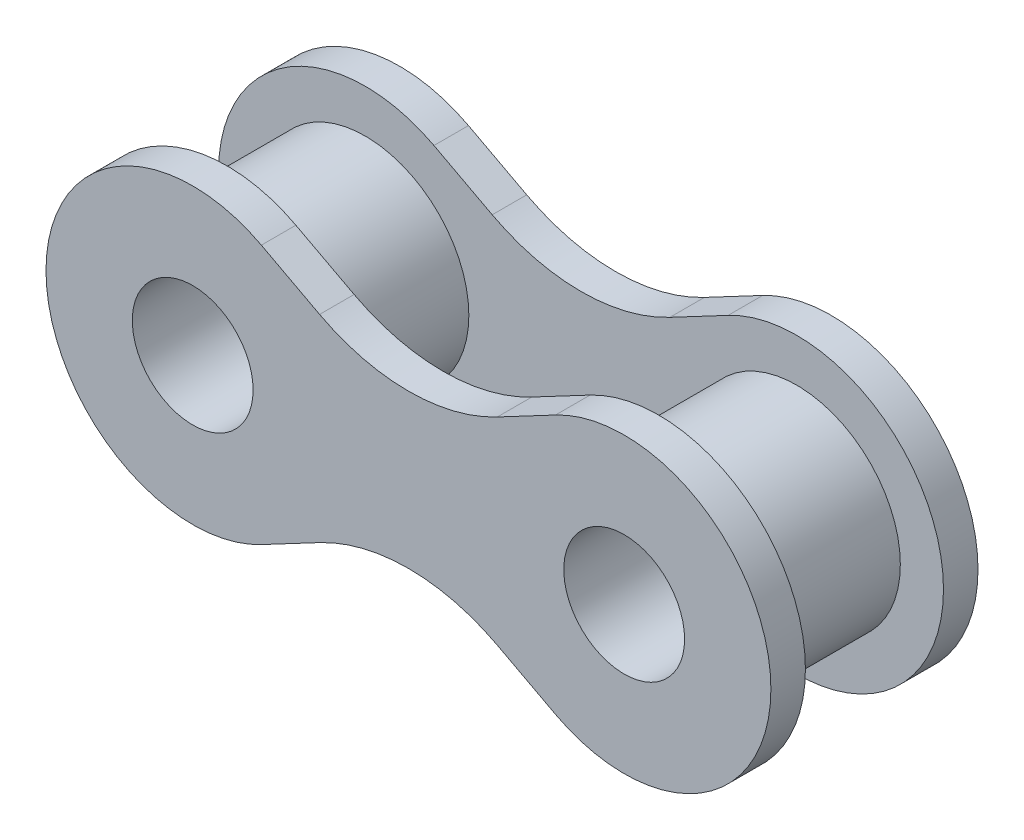
ISO-10303-21;
HEADER;
FILE_DESCRIPTION(('STEP AP214'),'2;1');
FILE_NAME('part.step','',(''),(''),'','','');
FILE_SCHEMA(('AUTOMOTIVE_DESIGN { 1 0 10303 214 1 1 1 1 }'));
ENDSEC;
DATA;
#1=APPLICATION_CONTEXT('core data for automotive mechanical design processes');
#2=APPLICATION_PROTOCOL_DEFINITION('international standard','automotive_design',2000,#1);
#3=PRODUCT_CONTEXT('',#1,'mechanical');
#4=PRODUCT('Part','Part','',(#3));
#5=PRODUCT_RELATED_PRODUCT_CATEGORY('part','',(#4));
#6=PRODUCT_DEFINITION_FORMATION('','',#4);
#7=PRODUCT_DEFINITION_CONTEXT('part definition',#1,'design');
#8=PRODUCT_DEFINITION('design','',#6,#7);
#9=PRODUCT_DEFINITION_SHAPE('','',#8);
#10=(LENGTH_UNIT() NAMED_UNIT(*) SI_UNIT(.MILLI.,.METRE.));
#11=(NAMED_UNIT(*) PLANE_ANGLE_UNIT() SI_UNIT($,.RADIAN.));
#12=(NAMED_UNIT(*) SI_UNIT($,.STERADIAN.) SOLID_ANGLE_UNIT());
#13=UNCERTAINTY_MEASURE_WITH_UNIT(LENGTH_MEASURE(1.E-05),#10,'distance_accuracy_value','');
#14=(GEOMETRIC_REPRESENTATION_CONTEXT(3) GLOBAL_UNCERTAINTY_ASSIGNED_CONTEXT((#13)) GLOBAL_UNIT_ASSIGNED_CONTEXT((#10,
#11,#12)) REPRESENTATION_CONTEXT('',''));
#15=CARTESIAN_POINT('',(0.,0.,0.));
#16=DIRECTION('',(0.,0.,1.));
#17=DIRECTION('',(1.,0.,0.));
#18=AXIS2_PLACEMENT_3D('',#15,#16,#17);
#19=CARTESIAN_POINT('',(-6.25,0.,-8.98528137423857));
#20=DIRECTION('',(0.,0.,1.));
#21=DIRECTION('',(1.,0.,0.));
#22=AXIS2_PLACEMENT_3D('',#19,#20,#21);
#23=CYLINDRICAL_SURFACE('',#22,3.);
#24=CARTESIAN_POINT('',(-6.25,0.,0.5));
#25=DIRECTION('',(0.,0.,1.));
#26=DIRECTION('',(1.,0.,0.));
#27=AXIS2_PLACEMENT_3D('',#24,#25,#26);
#28=CIRCLE('',#27,3.);
#29=CARTESIAN_POINT('',(-3.25,0.,0.5));
#30=VERTEX_POINT('',#29);
#31=EDGE_CURVE('E47',#30,#30,#28,.T.);
#32=ORIENTED_EDGE('',*,*,#31,.T.);
#33=EDGE_LOOP('',(#32));
#34=FACE_BOUND('',#33,.T.);
#35=CARTESIAN_POINT('',(-6.25,0.,4.5));
#36=DIRECTION('',(0.,0.,1.));
#37=DIRECTION('',(1.,0.,0.));
#38=AXIS2_PLACEMENT_3D('',#35,#36,#37);
#39=CIRCLE('',#38,3.);
#40=CARTESIAN_POINT('',(-3.25,0.,4.5));
#41=VERTEX_POINT('',#40);
#42=EDGE_CURVE('E170',#41,#41,#39,.F.);
#43=ORIENTED_EDGE('',*,*,#42,.T.);
#44=EDGE_LOOP('',(#43));
#45=FACE_BOUND('',#44,.T.);
#46=ADVANCED_FACE('F37',(#34,#45),#23,.T.);
#47=CARTESIAN_POINT('',(6.25,0.,0.5));
#48=DIRECTION('',(0.,0.,1.));
#49=DIRECTION('',(1.,0.,0.));
#50=AXIS2_PLACEMENT_3D('',#47,#48,#49);
#51=PLANE('',#50);
#52=CARTESIAN_POINT('',(6.25,0.,0.5));
#53=DIRECTION('',(0.,0.,1.));
#54=DIRECTION('',(1.,0.,0.));
#55=AXIS2_PLACEMENT_3D('',#52,#53,#54);
#56=CIRCLE('',#55,3.);
#57=CARTESIAN_POINT('',(9.25,0.,0.5));
#58=VERTEX_POINT('',#57);
#59=EDGE_CURVE('E11',#58,#58,#56,.T.);
#60=ORIENTED_EDGE('',*,*,#59,.F.);
#61=EDGE_LOOP('',(#60));
#62=FACE_BOUND('',#61,.T.);
#63=ORIENTED_EDGE('',*,*,#31,.F.);
#64=EDGE_LOOP('',(#63));
#65=FACE_BOUND('',#64,.T.);
#66=CARTESIAN_POINT('',(6.25,0.,0.5));
#67=DIRECTION('',(0.,0.,1.));
#68=DIRECTION('',(1.,0.,0.));
#69=AXIS2_PLACEMENT_3D('',#66,#67,#68);
#70=CIRCLE('',#69,4.25);
#71=CARTESIAN_POINT('',(4.26146170773168,-3.756090448882,0.5));
#72=VERTEX_POINT('',#71);
#73=CARTESIAN_POINT('',(4.26146170773168,3.756090448882,0.5));
#74=VERTEX_POINT('',#73);
#75=EDGE_CURVE('E156',#72,#74,#70,.T.);
#76=ORIENTED_EDGE('',*,*,#75,.T.);
#77=DIRECTION('',(-0.883785987972236,-0.467891362886662,0.));
#78=VECTOR('',#77,1.);
#79=CARTESIAN_POINT('',(2.57340249587665,2.86240313541777,0.5));
#80=LINE('',#79,#78);
#81=CARTESIAN_POINT('',(2.57340249587665,2.86240313541777,0.5));
#82=VERTEX_POINT('',#81);
#83=EDGE_CURVE('E101',#74,#82,#80,.T.);
#84=ORIENTED_EDGE('',*,*,#83,.T.);
#85=CARTESIAN_POINT('',(0.,7.72322606926507,0.5));
#86=DIRECTION('',(0.,0.,-1.));
#87=DIRECTION('',(1.,0.,0.));
#88=AXIS2_PLACEMENT_3D('',#85,#86,#87);
#89=CIRCLE('',#88,5.5);
#90=CARTESIAN_POINT('',(-2.57340249587665,2.86240313541777,0.5));
#91=VERTEX_POINT('',#90);
#92=EDGE_CURVE('E220',#82,#91,#89,.T.);
#93=ORIENTED_EDGE('',*,*,#92,.T.);
#94=DIRECTION('',(-0.883785987972236,0.467891362886663,0.));
#95=VECTOR('',#94,1.);
#96=CARTESIAN_POINT('',(-4.26146170773168,3.756090448882,0.5));
#97=LINE('',#96,#95);
#98=CARTESIAN_POINT('',(-4.26146170773168,3.756090448882,0.5));
#99=VERTEX_POINT('',#98);
#100=EDGE_CURVE('E222',#91,#99,#97,.T.);
#101=ORIENTED_EDGE('',*,*,#100,.T.);
#102=CARTESIAN_POINT('',(-6.25,0.,0.5));
#103=DIRECTION('',(0.,0.,1.));
#104=DIRECTION('',(1.,0.,0.));
#105=AXIS2_PLACEMENT_3D('',#102,#103,#104);
#106=CIRCLE('',#105,4.25);
#107=CARTESIAN_POINT('',(-4.26146170773168,-3.756090448882,0.5));
#108=VERTEX_POINT('',#107);
#109=EDGE_CURVE('E123',#99,#108,#106,.T.);
#110=ORIENTED_EDGE('',*,*,#109,.T.);
#111=DIRECTION('',(0.883785987972236,0.467891362886663,0.));
#112=VECTOR('',#111,1.);
#113=CARTESIAN_POINT('',(-4.26146170773168,-3.756090448882,0.5));
#114=LINE('',#113,#112);
#115=CARTESIAN_POINT('',(-2.57340249587665,-2.86240313541777,0.5));
#116=VERTEX_POINT('',#115);
#117=EDGE_CURVE('E117',#108,#116,#114,.T.);
#118=ORIENTED_EDGE('',*,*,#117,.T.);
#119=CARTESIAN_POINT('',(0.,-7.72322606926507,0.5));
#120=DIRECTION('',(0.,0.,-1.));
#121=DIRECTION('',(-1.,0.,0.));
#122=AXIS2_PLACEMENT_3D('',#119,#120,#121);
#123=CIRCLE('',#122,5.5);
#124=CARTESIAN_POINT('',(2.57340249587665,-2.86240313541777,0.5));
#125=VERTEX_POINT('',#124);
#126=EDGE_CURVE('E121',#116,#125,#123,.T.);
#127=ORIENTED_EDGE('',*,*,#126,.T.);
#128=DIRECTION('',(0.883785987972236,-0.467891362886662,0.));
#129=VECTOR('',#128,1.);
#130=CARTESIAN_POINT('',(2.57340249587665,-2.86240313541777,0.5));
#131=LINE('',#130,#129);
#132=EDGE_CURVE('E56',#125,#72,#131,.T.);
#133=ORIENTED_EDGE('',*,*,#132,.T.);
#134=EDGE_LOOP('',(#76,#84,#93,#101,#110,#118,#127,#133));
#135=FACE_BOUND('',#134,.T.);
#136=ADVANCED_FACE('F119',(#62,#65,#135),#51,.T.);
#137=CARTESIAN_POINT('',(6.25,0.,-0.5));
#138=DIRECTION('',(0.,0.,1.));
#139=DIRECTION('',(1.,0.,0.));
#140=AXIS2_PLACEMENT_3D('',#137,#138,#139);
#141=PLANE('',#140);
#142=CARTESIAN_POINT('',(6.25,0.,-0.5));
#143=DIRECTION('',(0.,0.,1.));
#144=DIRECTION('',(1.,0.,0.));
#145=AXIS2_PLACEMENT_3D('',#142,#143,#144);
#146=CIRCLE('',#145,4.25);
#147=CARTESIAN_POINT('',(4.26146170773168,-3.756090448882,-0.5));
#148=VERTEX_POINT('',#147);
#149=CARTESIAN_POINT('',(4.26146170773168,3.756090448882,-0.5));
#150=VERTEX_POINT('',#149);
#151=EDGE_CURVE('E141',#148,#150,#146,.T.);
#152=ORIENTED_EDGE('',*,*,#151,.F.);
#153=DIRECTION('',(0.883785987972236,-0.467891362886662,0.));
#154=VECTOR('',#153,1.);
#155=CARTESIAN_POINT('',(2.57340249587665,-2.86240313541777,-0.5));
#156=LINE('',#155,#154);
#157=CARTESIAN_POINT('',(2.57340249587665,-2.86240313541777,-0.5));
#158=VERTEX_POINT('',#157);
#159=EDGE_CURVE('E92',#158,#148,#156,.T.);
#160=ORIENTED_EDGE('',*,*,#159,.F.);
#161=CARTESIAN_POINT('',(0.,-7.72322606926507,-0.5));
#162=DIRECTION('',(0.,0.,-1.));
#163=DIRECTION('',(-1.,0.,0.));
#164=AXIS2_PLACEMENT_3D('',#161,#162,#163);
#165=CIRCLE('',#164,5.5);
#166=CARTESIAN_POINT('',(-2.57340249587665,-2.86240313541777,-0.5));
#167=VERTEX_POINT('',#166);
#168=EDGE_CURVE('E86',#167,#158,#165,.T.);
#169=ORIENTED_EDGE('',*,*,#168,.F.);
#170=DIRECTION('',(0.883785987972236,0.467891362886663,0.));
#171=VECTOR('',#170,1.);
#172=CARTESIAN_POINT('',(-4.26146170773168,-3.756090448882,-0.5));
#173=LINE('',#172,#171);
#174=CARTESIAN_POINT('',(-4.26146170773168,-3.756090448882,-0.5));
#175=VERTEX_POINT('',#174);
#176=EDGE_CURVE('E131',#175,#167,#173,.T.);
#177=ORIENTED_EDGE('',*,*,#176,.F.);
#178=CARTESIAN_POINT('',(-6.25,0.,-0.5));
#179=DIRECTION('',(0.,0.,1.));
#180=DIRECTION('',(1.,0.,0.));
#181=AXIS2_PLACEMENT_3D('',#178,#179,#180);
#182=CIRCLE('',#181,4.25);
#183=CARTESIAN_POINT('',(-4.26146170773168,3.756090448882,-0.5));
#184=VERTEX_POINT('',#183);
#185=EDGE_CURVE('E151',#184,#175,#182,.T.);
#186=ORIENTED_EDGE('',*,*,#185,.F.);
#187=DIRECTION('',(-0.883785987972236,0.467891362886663,0.));
#188=VECTOR('',#187,1.);
#189=CARTESIAN_POINT('',(-4.26146170773168,3.756090448882,-0.5));
#190=LINE('',#189,#188);
#191=CARTESIAN_POINT('',(-2.57340249587665,2.86240313541777,-0.5));
#192=VERTEX_POINT('',#191);
#193=EDGE_CURVE('E149',#192,#184,#190,.T.);
#194=ORIENTED_EDGE('',*,*,#193,.F.);
#195=CARTESIAN_POINT('',(0.,7.72322606926507,-0.5));
#196=DIRECTION('',(0.,0.,-1.));
#197=DIRECTION('',(1.,0.,0.));
#198=AXIS2_PLACEMENT_3D('',#195,#196,#197);
#199=CIRCLE('',#198,5.5);
#200=CARTESIAN_POINT('',(2.57340249587665,2.86240313541777,-0.5));
#201=VERTEX_POINT('',#200);
#202=EDGE_CURVE('E147',#201,#192,#199,.T.);
#203=ORIENTED_EDGE('',*,*,#202,.F.);
#204=DIRECTION('',(-0.883785987972236,-0.467891362886662,0.));
#205=VECTOR('',#204,1.);
#206=CARTESIAN_POINT('',(2.57340249587665,2.86240313541777,-0.5));
#207=LINE('',#206,#205);
#208=EDGE_CURVE('E144',#150,#201,#207,.T.);
#209=ORIENTED_EDGE('',*,*,#208,.F.);
#210=EDGE_LOOP('',(#152,#160,#169,#177,#186,#194,#203,#209));
#211=FACE_BOUND('',#210,.T.);
#212=CARTESIAN_POINT('',(-6.25,0.,-0.5));
#213=DIRECTION('',(0.,0.,1.));
#214=DIRECTION('',(1.,0.,0.));
#215=AXIS2_PLACEMENT_3D('',#212,#213,#214);
#216=CIRCLE('',#215,1.75);
#217=CARTESIAN_POINT('',(-4.5,0.,-0.5));
#218=VERTEX_POINT('',#217);
#219=EDGE_CURVE('E145',#218,#218,#216,.T.);
#220=ORIENTED_EDGE('',*,*,#219,.T.);
#221=EDGE_LOOP('',(#220));
#222=FACE_BOUND('',#221,.T.);
#223=CARTESIAN_POINT('',(6.25,0.,-0.5));
#224=DIRECTION('',(0.,0.,1.));
#225=DIRECTION('',(1.,0.,0.));
#226=AXIS2_PLACEMENT_3D('',#223,#224,#225);
#227=CIRCLE('',#226,1.75);
#228=CARTESIAN_POINT('',(8.,0.,-0.5));
#229=VERTEX_POINT('',#228);
#230=EDGE_CURVE('E177',#229,#229,#227,.T.);
#231=ORIENTED_EDGE('',*,*,#230,.T.);
#232=EDGE_LOOP('',(#231));
#233=FACE_BOUND('',#232,.T.);
#234=ADVANCED_FACE('F235',(#211,#222,#233),#141,.F.);
#235=CARTESIAN_POINT('',(6.25,0.,0.5));
#236=DIRECTION('',(0.,0.,-1.));
#237=DIRECTION('',(-1.,0.,0.));
#238=AXIS2_PLACEMENT_3D('',#235,#236,#237);
#239=CYLINDRICAL_SURFACE('',#238,4.25);
#240=ORIENTED_EDGE('',*,*,#151,.T.);
#241=DIRECTION('',(0.,0.,-1.));
#242=VECTOR('',#241,1.);
#243=CARTESIAN_POINT('',(4.26146170773168,3.756090448882,0.5));
#244=LINE('',#243,#242);
#245=EDGE_CURVE('E169',#74,#150,#244,.T.);
#246=ORIENTED_EDGE('',*,*,#245,.F.);
#247=ORIENTED_EDGE('',*,*,#75,.F.);
#248=DIRECTION('',(0.,0.,-1.));
#249=VECTOR('',#248,1.);
#250=CARTESIAN_POINT('',(4.26146170773168,-3.756090448882,0.5));
#251=LINE('',#250,#249);
#252=EDGE_CURVE('E137',#72,#148,#251,.T.);
#253=ORIENTED_EDGE('',*,*,#252,.T.);
#254=EDGE_LOOP('',(#240,#246,#247,#253));
#255=FACE_BOUND('',#254,.T.);
#256=ADVANCED_FACE('F39',(#255),#239,.T.);
#257=CARTESIAN_POINT('',(2.57340249587665,2.86240313541777,0.5));
#258=DIRECTION('',(0.467891362886662,-0.883785987972237,0.));
#259=DIRECTION('',(0.883785987972237,0.467891362886662,0.));
#260=AXIS2_PLACEMENT_3D('',#257,#258,#259);
#261=PLANE('',#260);
#262=ORIENTED_EDGE('',*,*,#208,.T.);
#263=DIRECTION('',(0.,0.,-1.));
#264=VECTOR('',#263,1.);
#265=CARTESIAN_POINT('',(2.57340249587665,2.86240313541777,0.5));
#266=LINE('',#265,#264);
#267=EDGE_CURVE('E166',#82,#201,#266,.T.);
#268=ORIENTED_EDGE('',*,*,#267,.F.);
#269=ORIENTED_EDGE('',*,*,#83,.F.);
#270=ORIENTED_EDGE('',*,*,#245,.T.);
#271=EDGE_LOOP('',(#262,#268,#269,#270));
#272=FACE_BOUND('',#271,.T.);
#273=ADVANCED_FACE('F272',(#272),#261,.F.);
#274=CARTESIAN_POINT('',(0.,7.72322606926507,0.5));
#275=DIRECTION('',(0.,0.,-1.));
#276=DIRECTION('',(-1.,0.,0.));
#277=AXIS2_PLACEMENT_3D('',#274,#275,#276);
#278=CYLINDRICAL_SURFACE('',#277,5.5);
#279=ORIENTED_EDGE('',*,*,#202,.T.);
#280=DIRECTION('',(0.,0.,-1.));
#281=VECTOR('',#280,1.);
#282=CARTESIAN_POINT('',(-2.57340249587665,2.86240313541777,0.5));
#283=LINE('',#282,#281);
#284=EDGE_CURVE('E163',#91,#192,#283,.T.);
#285=ORIENTED_EDGE('',*,*,#284,.F.);
#286=ORIENTED_EDGE('',*,*,#92,.F.);
#287=ORIENTED_EDGE('',*,*,#267,.T.);
#288=EDGE_LOOP('',(#279,#285,#286,#287));
#289=FACE_BOUND('',#288,.T.);
#290=ADVANCED_FACE('F276',(#289),#278,.F.);
#291=CARTESIAN_POINT('',(-4.26146170773168,3.756090448882,0.5));
#292=DIRECTION('',(-0.467891362886663,-0.883785987972236,0.));
#293=DIRECTION('',(0.883785987972236,-0.467891362886663,0.));
#294=AXIS2_PLACEMENT_3D('',#291,#292,#293);
#295=PLANE('',#294);
#296=ORIENTED_EDGE('',*,*,#193,.T.);
#297=DIRECTION('',(0.,0.,-1.));
#298=VECTOR('',#297,1.);
#299=CARTESIAN_POINT('',(-4.26146170773168,3.756090448882,0.5));
#300=LINE('',#299,#298);
#301=EDGE_CURVE('E160',#99,#184,#300,.T.);
#302=ORIENTED_EDGE('',*,*,#301,.F.);
#303=ORIENTED_EDGE('',*,*,#100,.F.);
#304=ORIENTED_EDGE('',*,*,#284,.T.);
#305=EDGE_LOOP('',(#296,#302,#303,#304));
#306=FACE_BOUND('',#305,.T.);
#307=ADVANCED_FACE('F228',(#306),#295,.F.);
#308=CARTESIAN_POINT('',(-6.25,0.,0.5));
#309=DIRECTION('',(0.,0.,-1.));
#310=DIRECTION('',(-1.,0.,0.));
#311=AXIS2_PLACEMENT_3D('',#308,#309,#310);
#312=CYLINDRICAL_SURFACE('',#311,4.25);
#313=ORIENTED_EDGE('',*,*,#185,.T.);
#314=DIRECTION('',(0.,0.,-1.));
#315=VECTOR('',#314,1.);
#316=CARTESIAN_POINT('',(-4.26146170773168,-3.756090448882,0.5));
#317=LINE('',#316,#315);
#318=EDGE_CURVE('E132',#108,#175,#317,.T.);
#319=ORIENTED_EDGE('',*,*,#318,.F.);
#320=ORIENTED_EDGE('',*,*,#109,.F.);
#321=ORIENTED_EDGE('',*,*,#301,.T.);
#322=EDGE_LOOP('',(#313,#319,#320,#321));
#323=FACE_BOUND('',#322,.T.);
#324=ADVANCED_FACE('F232',(#323),#312,.T.);
#325=CARTESIAN_POINT('',(-4.26146170773168,-3.756090448882,0.5));
#326=DIRECTION('',(-0.467891362886663,0.883785987972236,0.));
#327=DIRECTION('',(-0.883785987972236,-0.467891362886663,0.));
#328=AXIS2_PLACEMENT_3D('',#325,#326,#327);
#329=PLANE('',#328);
#330=ORIENTED_EDGE('',*,*,#176,.T.);
#331=DIRECTION('',(0.,0.,-1.));
#332=VECTOR('',#331,1.);
#333=CARTESIAN_POINT('',(-2.57340249587665,-2.86240313541777,0.5));
#334=LINE('',#333,#332);
#335=EDGE_CURVE('E128',#116,#167,#334,.T.);
#336=ORIENTED_EDGE('',*,*,#335,.F.);
#337=ORIENTED_EDGE('',*,*,#117,.F.);
#338=ORIENTED_EDGE('',*,*,#318,.T.);
#339=EDGE_LOOP('',(#330,#336,#337,#338));
#340=FACE_BOUND('',#339,.T.);
#341=ADVANCED_FACE('F129',(#340),#329,.F.);
#342=CARTESIAN_POINT('',(0.,-7.72322606926507,0.5));
#343=DIRECTION('',(0.,0.,-1.));
#344=DIRECTION('',(-1.,0.,0.));
#345=AXIS2_PLACEMENT_3D('',#342,#343,#344);
#346=CYLINDRICAL_SURFACE('',#345,5.5);
#347=ORIENTED_EDGE('',*,*,#168,.T.);
#348=DIRECTION('',(0.,0.,-1.));
#349=VECTOR('',#348,1.);
#350=CARTESIAN_POINT('',(2.57340249587665,-2.86240313541777,0.5));
#351=LINE('',#350,#349);
#352=EDGE_CURVE('E133',#125,#158,#351,.T.);
#353=ORIENTED_EDGE('',*,*,#352,.F.);
#354=ORIENTED_EDGE('',*,*,#126,.F.);
#355=ORIENTED_EDGE('',*,*,#335,.T.);
#356=EDGE_LOOP('',(#347,#353,#354,#355));
#357=FACE_BOUND('',#356,.T.);
#358=ADVANCED_FACE('F135',(#357),#346,.F.);
#359=CARTESIAN_POINT('',(2.57340249587665,-2.86240313541777,0.5));
#360=DIRECTION('',(0.467891362886662,0.883785987972237,0.));
#361=DIRECTION('',(-0.883785987972237,0.467891362886662,0.));
#362=AXIS2_PLACEMENT_3D('',#359,#360,#361);
#363=PLANE('',#362);
#364=ORIENTED_EDGE('',*,*,#159,.T.);
#365=ORIENTED_EDGE('',*,*,#252,.F.);
#366=ORIENTED_EDGE('',*,*,#132,.F.);
#367=ORIENTED_EDGE('',*,*,#352,.T.);
#368=EDGE_LOOP('',(#364,#365,#366,#367));
#369=FACE_BOUND('',#368,.T.);
#370=ADVANCED_FACE('F241',(#369),#363,.F.);
#371=CARTESIAN_POINT('',(-6.25,0.,0.5));
#372=DIRECTION('',(0.,0.,-1.));
#373=DIRECTION('',(-1.,0.,0.));
#374=AXIS2_PLACEMENT_3D('',#371,#372,#373);
#375=CYLINDRICAL_SURFACE('',#374,1.75);
#376=CARTESIAN_POINT('',(-6.25,0.,5.5));
#377=DIRECTION('',(0.,0.,1.));
#378=DIRECTION('',(1.,0.,0.));
#379=AXIS2_PLACEMENT_3D('',#376,#377,#378);
#380=CIRCLE('',#379,1.75);
#381=CARTESIAN_POINT('',(-4.5,0.,5.5));
#382=VERTEX_POINT('',#381);
#383=EDGE_CURVE('E172',#382,#382,#380,.T.);
#384=ORIENTED_EDGE('',*,*,#383,.T.);
#385=EDGE_LOOP('',(#384));
#386=FACE_BOUND('',#385,.T.);
#387=ORIENTED_EDGE('',*,*,#219,.F.);
#388=EDGE_LOOP('',(#387));
#389=FACE_BOUND('',#388,.T.);
#390=ADVANCED_FACE('F243',(#386,#389),#375,.F.);
#391=CARTESIAN_POINT('',(6.25,0.,0.5));
#392=DIRECTION('',(0.,0.,-1.));
#393=DIRECTION('',(-1.,0.,0.));
#394=AXIS2_PLACEMENT_3D('',#391,#392,#393);
#395=CYLINDRICAL_SURFACE('',#394,1.75);
#396=ORIENTED_EDGE('',*,*,#230,.F.);
#397=EDGE_LOOP('',(#396));
#398=FACE_BOUND('',#397,.T.);
#399=CARTESIAN_POINT('',(6.25,0.,5.5));
#400=DIRECTION('',(0.,0.,1.));
#401=DIRECTION('',(1.,0.,0.));
#402=AXIS2_PLACEMENT_3D('',#399,#400,#401);
#403=CIRCLE('',#402,1.75);
#404=CARTESIAN_POINT('',(8.,0.,5.5));
#405=VERTEX_POINT('',#404);
#406=EDGE_CURVE('E445',#405,#405,#403,.T.);
#407=ORIENTED_EDGE('',*,*,#406,.T.);
#408=EDGE_LOOP('',(#407));
#409=FACE_BOUND('',#408,.T.);
#410=ADVANCED_FACE('F249',(#398,#409),#395,.F.);
#411=CARTESIAN_POINT('',(-6.25,0.,5.5));
#412=DIRECTION('',(0.,0.,1.));
#413=DIRECTION('',(1.,0.,0.));
#414=AXIS2_PLACEMENT_3D('',#411,#412,#413);
#415=PLANE('',#414);
#416=ORIENTED_EDGE('',*,*,#383,.F.);
#417=EDGE_LOOP('',(#416));
#418=FACE_BOUND('',#417,.T.);
#419=CARTESIAN_POINT('',(-6.25,0.,5.5));
#420=DIRECTION('',(0.,0.,1.));
#421=DIRECTION('',(1.,0.,0.));
#422=AXIS2_PLACEMENT_3D('',#419,#420,#421);
#423=CIRCLE('',#422,4.25);
#424=CARTESIAN_POINT('',(-4.26146170773168,3.756090448882,5.5));
#425=VERTEX_POINT('',#424);
#426=CARTESIAN_POINT('',(-4.26146170773168,-3.756090448882,5.5));
#427=VERTEX_POINT('',#426);
#428=EDGE_CURVE('E447',#425,#427,#423,.T.);
#429=ORIENTED_EDGE('',*,*,#428,.T.);
#430=DIRECTION('',(0.883785987972236,0.467891362886663,0.));
#431=VECTOR('',#430,1.);
#432=CARTESIAN_POINT('',(-4.26146170773168,-3.756090448882,5.5));
#433=LINE('',#432,#431);
#434=CARTESIAN_POINT('',(-2.57340249587665,-2.86240313541777,5.5));
#435=VERTEX_POINT('',#434);
#436=EDGE_CURVE('E452',#427,#435,#433,.T.);
#437=ORIENTED_EDGE('',*,*,#436,.T.);
#438=CARTESIAN_POINT('',(0.,-7.72322606926507,5.5));
#439=DIRECTION('',(0.,0.,-1.));
#440=DIRECTION('',(1.,0.,0.));
#441=AXIS2_PLACEMENT_3D('',#438,#439,#440);
#442=CIRCLE('',#441,5.5);
#443=CARTESIAN_POINT('',(2.57340249587665,-2.86240313541777,5.5));
#444=VERTEX_POINT('',#443);
#445=EDGE_CURVE('E479',#435,#444,#442,.T.);
#446=ORIENTED_EDGE('',*,*,#445,.T.);
#447=DIRECTION('',(0.883785987972237,-0.467891362886662,0.));
#448=VECTOR('',#447,1.);
#449=CARTESIAN_POINT('',(2.57340249587665,-2.86240313541777,5.5));
#450=LINE('',#449,#448);
#451=CARTESIAN_POINT('',(4.26146170773168,-3.756090448882,5.5));
#452=VERTEX_POINT('',#451);
#453=EDGE_CURVE('E482',#444,#452,#450,.T.);
#454=ORIENTED_EDGE('',*,*,#453,.T.);
#455=CARTESIAN_POINT('',(6.25,0.,5.5));
#456=DIRECTION('',(0.,0.,1.));
#457=DIRECTION('',(1.,0.,0.));
#458=AXIS2_PLACEMENT_3D('',#455,#456,#457);
#459=CIRCLE('',#458,4.25);
#460=CARTESIAN_POINT('',(4.26146170773168,3.756090448882,5.5));
#461=VERTEX_POINT('',#460);
#462=EDGE_CURVE('E485',#452,#461,#459,.T.);
#463=ORIENTED_EDGE('',*,*,#462,.T.);
#464=DIRECTION('',(-0.883785987972237,-0.467891362886662,0.));
#465=VECTOR('',#464,1.);
#466=CARTESIAN_POINT('',(4.26146170773168,3.756090448882,5.5));
#467=LINE('',#466,#465);
#468=CARTESIAN_POINT('',(2.57340249587664,2.86240313541777,5.5));
#469=VERTEX_POINT('',#468);
#470=EDGE_CURVE('E488',#461,#469,#467,.T.);
#471=ORIENTED_EDGE('',*,*,#470,.T.);
#472=CARTESIAN_POINT('',(0.,7.72322606926507,5.5));
#473=DIRECTION('',(0.,0.,-1.));
#474=DIRECTION('',(1.,0.,0.));
#475=AXIS2_PLACEMENT_3D('',#472,#473,#474);
#476=CIRCLE('',#475,5.5);
#477=CARTESIAN_POINT('',(-2.57340249587665,2.86240313541777,5.5));
#478=VERTEX_POINT('',#477);
#479=EDGE_CURVE('E490',#469,#478,#476,.T.);
#480=ORIENTED_EDGE('',*,*,#479,.T.);
#481=DIRECTION('',(-0.883785987972236,0.467891362886663,0.));
#482=VECTOR('',#481,1.);
#483=CARTESIAN_POINT('',(-2.57340249587665,2.86240313541777,5.5));
#484=LINE('',#483,#482);
#485=EDGE_CURVE('E191',#478,#425,#484,.T.);
#486=ORIENTED_EDGE('',*,*,#485,.T.);
#487=EDGE_LOOP('',(#429,#437,#446,#454,#463,#471,#480,#486));
#488=FACE_BOUND('',#487,.T.);
#489=ORIENTED_EDGE('',*,*,#406,.F.);
#490=EDGE_LOOP('',(#489));
#491=FACE_BOUND('',#490,.T.);
#492=ADVANCED_FACE('F264',(#418,#488,#491),#415,.T.);
#493=CARTESIAN_POINT('',(-6.25,0.,4.5));
#494=DIRECTION('',(0.,0.,1.));
#495=DIRECTION('',(1.,0.,0.));
#496=AXIS2_PLACEMENT_3D('',#493,#494,#495);
#497=CYLINDRICAL_SURFACE('',#496,4.25);
#498=ORIENTED_EDGE('',*,*,#428,.F.);
#499=DIRECTION('',(0.,0.,1.));
#500=VECTOR('',#499,1.);
#501=CARTESIAN_POINT('',(-4.26146170773168,3.756090448882,4.5));
#502=LINE('',#501,#500);
#503=CARTESIAN_POINT('',(-4.26146170773168,3.756090448882,4.5));
#504=VERTEX_POINT('',#503);
#505=EDGE_CURVE('E173',#504,#425,#502,.T.);
#506=ORIENTED_EDGE('',*,*,#505,.F.);
#507=CARTESIAN_POINT('',(-6.25,0.,4.5));
#508=DIRECTION('',(0.,0.,1.));
#509=DIRECTION('',(1.,0.,0.));
#510=AXIS2_PLACEMENT_3D('',#507,#508,#509);
#511=CIRCLE('',#510,4.25);
#512=CARTESIAN_POINT('',(-4.26146170773168,-3.756090448882,4.5));
#513=VERTEX_POINT('',#512);
#514=EDGE_CURVE('E455',#504,#513,#511,.T.);
#515=ORIENTED_EDGE('',*,*,#514,.T.);
#516=DIRECTION('',(0.,0.,1.));
#517=VECTOR('',#516,1.);
#518=CARTESIAN_POINT('',(-4.26146170773168,-3.756090448882,4.5));
#519=LINE('',#518,#517);
#520=EDGE_CURVE('E208',#513,#427,#519,.T.);
#521=ORIENTED_EDGE('',*,*,#520,.T.);
#522=EDGE_LOOP('',(#498,#506,#515,#521));
#523=FACE_BOUND('',#522,.T.);
#524=ADVANCED_FACE('F338',(#523),#497,.T.);
#525=CARTESIAN_POINT('',(-2.57340249587665,2.86240313541777,4.5));
#526=DIRECTION('',(0.467891362886663,0.883785987972236,0.));
#527=DIRECTION('',(-0.883785987972236,0.467891362886663,0.));
#528=AXIS2_PLACEMENT_3D('',#525,#526,#527);
#529=PLANE('',#528);
#530=ORIENTED_EDGE('',*,*,#485,.F.);
#531=DIRECTION('',(0.,0.,1.));
#532=VECTOR('',#531,1.);
#533=CARTESIAN_POINT('',(-2.57340249587665,2.86240313541777,4.5));
#534=LINE('',#533,#532);
#535=CARTESIAN_POINT('',(-2.57340249587665,2.86240313541777,4.5));
#536=VERTEX_POINT('',#535);
#537=EDGE_CURVE('E180',#536,#478,#534,.T.);
#538=ORIENTED_EDGE('',*,*,#537,.F.);
#539=DIRECTION('',(-0.883785987972236,0.467891362886663,0.));
#540=VECTOR('',#539,1.);
#541=CARTESIAN_POINT('',(-2.57340249587665,2.86240313541777,4.5));
#542=LINE('',#541,#540);
#543=EDGE_CURVE('E210',#536,#504,#542,.T.);
#544=ORIENTED_EDGE('',*,*,#543,.T.);
#545=ORIENTED_EDGE('',*,*,#505,.T.);
#546=EDGE_LOOP('',(#530,#538,#544,#545));
#547=FACE_BOUND('',#546,.T.);
#548=ADVANCED_FACE('F349',(#547),#529,.T.);
#549=CARTESIAN_POINT('',(0.,7.72322606926507,4.5));
#550=DIRECTION('',(0.,0.,1.));
#551=DIRECTION('',(1.,0.,0.));
#552=AXIS2_PLACEMENT_3D('',#549,#550,#551);
#553=CYLINDRICAL_SURFACE('',#552,5.5);
#554=ORIENTED_EDGE('',*,*,#479,.F.);
#555=DIRECTION('',(0.,0.,1.));
#556=VECTOR('',#555,1.);
#557=CARTESIAN_POINT('',(2.57340249587664,2.86240313541777,4.5));
#558=LINE('',#557,#556);
#559=CARTESIAN_POINT('',(2.57340249587664,2.86240313541777,4.5));
#560=VERTEX_POINT('',#559);
#561=EDGE_CURVE('E188',#560,#469,#558,.T.);
#562=ORIENTED_EDGE('',*,*,#561,.F.);
#563=CARTESIAN_POINT('',(0.,7.72322606926507,4.5));
#564=DIRECTION('',(0.,0.,-1.));
#565=DIRECTION('',(1.,0.,0.));
#566=AXIS2_PLACEMENT_3D('',#563,#564,#565);
#567=CIRCLE('',#566,5.5);
#568=EDGE_CURVE('E473',#560,#536,#567,.T.);
#569=ORIENTED_EDGE('',*,*,#568,.T.);
#570=ORIENTED_EDGE('',*,*,#537,.T.);
#571=EDGE_LOOP('',(#554,#562,#569,#570));
#572=FACE_BOUND('',#571,.T.);
#573=ADVANCED_FACE('F359',(#572),#553,.F.);
#574=CARTESIAN_POINT('',(4.26146170773168,3.756090448882,4.5));
#575=DIRECTION('',(-0.467891362886662,0.883785987972236,0.));
#576=DIRECTION('',(-0.883785987972237,-0.467891362886662,0.));
#577=AXIS2_PLACEMENT_3D('',#574,#575,#576);
#578=PLANE('',#577);
#579=ORIENTED_EDGE('',*,*,#470,.F.);
#580=DIRECTION('',(0.,0.,1.));
#581=VECTOR('',#580,1.);
#582=CARTESIAN_POINT('',(4.26146170773168,3.756090448882,4.5));
#583=LINE('',#582,#581);
#584=CARTESIAN_POINT('',(4.26146170773168,3.756090448882,4.5));
#585=VERTEX_POINT('',#584);
#586=EDGE_CURVE('E196',#585,#461,#583,.T.);
#587=ORIENTED_EDGE('',*,*,#586,.F.);
#588=DIRECTION('',(-0.883785987972237,-0.467891362886662,0.));
#589=VECTOR('',#588,1.);
#590=CARTESIAN_POINT('',(4.26146170773168,3.756090448882,4.5));
#591=LINE('',#590,#589);
#592=EDGE_CURVE('E470',#585,#560,#591,.T.);
#593=ORIENTED_EDGE('',*,*,#592,.T.);
#594=ORIENTED_EDGE('',*,*,#561,.T.);
#595=EDGE_LOOP('',(#579,#587,#593,#594));
#596=FACE_BOUND('',#595,.T.);
#597=ADVANCED_FACE('F368',(#596),#578,.T.);
#598=CARTESIAN_POINT('',(6.25,0.,4.5));
#599=DIRECTION('',(0.,0.,1.));
#600=DIRECTION('',(1.,0.,0.));
#601=AXIS2_PLACEMENT_3D('',#598,#599,#600);
#602=CYLINDRICAL_SURFACE('',#601,4.25);
#603=ORIENTED_EDGE('',*,*,#462,.F.);
#604=DIRECTION('',(0.,0.,1.));
#605=VECTOR('',#604,1.);
#606=CARTESIAN_POINT('',(4.26146170773168,-3.756090448882,4.5));
#607=LINE('',#606,#605);
#608=CARTESIAN_POINT('',(4.26146170773168,-3.756090448882,4.5));
#609=VERTEX_POINT('',#608);
#610=EDGE_CURVE('E199',#609,#452,#607,.T.);
#611=ORIENTED_EDGE('',*,*,#610,.F.);
#612=CARTESIAN_POINT('',(6.25,0.,4.5));
#613=DIRECTION('',(0.,0.,1.));
#614=DIRECTION('',(1.,0.,0.));
#615=AXIS2_PLACEMENT_3D('',#612,#613,#614);
#616=CIRCLE('',#615,4.25);
#617=EDGE_CURVE('E467',#609,#585,#616,.T.);
#618=ORIENTED_EDGE('',*,*,#617,.T.);
#619=ORIENTED_EDGE('',*,*,#586,.T.);
#620=EDGE_LOOP('',(#603,#611,#618,#619));
#621=FACE_BOUND('',#620,.T.);
#622=ADVANCED_FACE('F378',(#621),#602,.T.);
#623=CARTESIAN_POINT('',(2.57340249587665,-2.86240313541777,4.5));
#624=DIRECTION('',(-0.467891362886662,-0.883785987972237,0.));
#625=DIRECTION('',(0.883785987972236,-0.467891362886662,0.));
#626=AXIS2_PLACEMENT_3D('',#623,#624,#625);
#627=PLANE('',#626);
#628=ORIENTED_EDGE('',*,*,#453,.F.);
#629=DIRECTION('',(0.,0.,1.));
#630=VECTOR('',#629,1.);
#631=CARTESIAN_POINT('',(2.57340249587665,-2.86240313541777,4.5));
#632=LINE('',#631,#630);
#633=CARTESIAN_POINT('',(2.57340249587665,-2.86240313541777,4.5));
#634=VERTEX_POINT('',#633);
#635=EDGE_CURVE('E202',#634,#444,#632,.T.);
#636=ORIENTED_EDGE('',*,*,#635,.F.);
#637=DIRECTION('',(0.883785987972237,-0.467891362886662,0.));
#638=VECTOR('',#637,1.);
#639=CARTESIAN_POINT('',(2.57340249587665,-2.86240313541777,4.5));
#640=LINE('',#639,#638);
#641=EDGE_CURVE('E464',#634,#609,#640,.T.);
#642=ORIENTED_EDGE('',*,*,#641,.T.);
#643=ORIENTED_EDGE('',*,*,#610,.T.);
#644=EDGE_LOOP('',(#628,#636,#642,#643));
#645=FACE_BOUND('',#644,.T.);
#646=ADVANCED_FACE('F388',(#645),#627,.T.);
#647=CARTESIAN_POINT('',(0.,-7.72322606926507,4.5));
#648=DIRECTION('',(0.,0.,1.));
#649=DIRECTION('',(1.,0.,0.));
#650=AXIS2_PLACEMENT_3D('',#647,#648,#649);
#651=CYLINDRICAL_SURFACE('',#650,5.5);
#652=ORIENTED_EDGE('',*,*,#445,.F.);
#653=DIRECTION('',(0.,0.,1.));
#654=VECTOR('',#653,1.);
#655=CARTESIAN_POINT('',(-2.57340249587665,-2.86240313541777,4.5));
#656=LINE('',#655,#654);
#657=CARTESIAN_POINT('',(-2.57340249587665,-2.86240313541777,4.5));
#658=VERTEX_POINT('',#657);
#659=EDGE_CURVE('E205',#658,#435,#656,.T.);
#660=ORIENTED_EDGE('',*,*,#659,.F.);
#661=CARTESIAN_POINT('',(0.,-7.72322606926507,4.5));
#662=DIRECTION('',(0.,0.,-1.));
#663=DIRECTION('',(1.,0.,0.));
#664=AXIS2_PLACEMENT_3D('',#661,#662,#663);
#665=CIRCLE('',#664,5.5);
#666=EDGE_CURVE('E461',#658,#634,#665,.T.);
#667=ORIENTED_EDGE('',*,*,#666,.T.);
#668=ORIENTED_EDGE('',*,*,#635,.T.);
#669=EDGE_LOOP('',(#652,#660,#667,#668));
#670=FACE_BOUND('',#669,.T.);
#671=ADVANCED_FACE('F398',(#670),#651,.F.);
#672=CARTESIAN_POINT('',(-4.26146170773168,-3.756090448882,4.5));
#673=DIRECTION('',(0.467891362886663,-0.883785987972236,0.));
#674=DIRECTION('',(0.883785987972236,0.467891362886663,0.));
#675=AXIS2_PLACEMENT_3D('',#672,#673,#674);
#676=PLANE('',#675);
#677=ORIENTED_EDGE('',*,*,#436,.F.);
#678=ORIENTED_EDGE('',*,*,#520,.F.);
#679=DIRECTION('',(0.883785987972236,0.467891362886663,0.));
#680=VECTOR('',#679,1.);
#681=CARTESIAN_POINT('',(-4.26146170773168,-3.756090448882,4.5));
#682=LINE('',#681,#680);
#683=EDGE_CURVE('E458',#513,#658,#682,.T.);
#684=ORIENTED_EDGE('',*,*,#683,.T.);
#685=ORIENTED_EDGE('',*,*,#659,.T.);
#686=EDGE_LOOP('',(#677,#678,#684,#685));
#687=FACE_BOUND('',#686,.T.);
#688=ADVANCED_FACE('F408',(#687),#676,.T.);
#689=CARTESIAN_POINT('',(-6.25,0.,4.5));
#690=DIRECTION('',(0.,0.,1.));
#691=DIRECTION('',(1.,0.,0.));
#692=AXIS2_PLACEMENT_3D('',#689,#690,#691);
#693=PLANE('',#692);
#694=CARTESIAN_POINT('',(6.25,0.,4.5));
#695=DIRECTION('',(0.,0.,1.));
#696=DIRECTION('',(1.,0.,0.));
#697=AXIS2_PLACEMENT_3D('',#694,#695,#696);
#698=CIRCLE('',#697,3.);
#699=CARTESIAN_POINT('',(9.25,0.,4.5));
#700=VERTEX_POINT('',#699);
#701=EDGE_CURVE('E41',#700,#700,#698,.T.);
#702=ORIENTED_EDGE('',*,*,#701,.T.);
#703=EDGE_LOOP('',(#702));
#704=FACE_BOUND('',#703,.T.);
#705=ORIENTED_EDGE('',*,*,#42,.F.);
#706=EDGE_LOOP('',(#705));
#707=FACE_BOUND('',#706,.T.);
#708=ORIENTED_EDGE('',*,*,#514,.F.);
#709=ORIENTED_EDGE('',*,*,#543,.F.);
#710=ORIENTED_EDGE('',*,*,#568,.F.);
#711=ORIENTED_EDGE('',*,*,#592,.F.);
#712=ORIENTED_EDGE('',*,*,#617,.F.);
#713=ORIENTED_EDGE('',*,*,#641,.F.);
#714=ORIENTED_EDGE('',*,*,#666,.F.);
#715=ORIENTED_EDGE('',*,*,#683,.F.);
#716=EDGE_LOOP('',(#708,#709,#710,#711,#712,#713,#714,#715));
#717=FACE_BOUND('',#716,.T.);
#718=ADVANCED_FACE('F418',(#704,#707,#717),#693,.F.);
#719=CARTESIAN_POINT('',(6.25,0.,-8.98528137423857));
#720=DIRECTION('',(0.,0.,1.));
#721=DIRECTION('',(1.,0.,0.));
#722=AXIS2_PLACEMENT_3D('',#719,#720,#721);
#723=CYLINDRICAL_SURFACE('',#722,3.);
#724=ORIENTED_EDGE('',*,*,#59,.T.);
#725=EDGE_LOOP('',(#724));
#726=FACE_BOUND('',#725,.T.);
#727=ORIENTED_EDGE('',*,*,#701,.F.);
#728=EDGE_LOOP('',(#727));
#729=FACE_BOUND('',#728,.T.);
#730=ADVANCED_FACE('F428',(#726,#729),#723,.T.);
#731=CLOSED_SHELL('',(#46,#136,#234,#256,#273,#290,#307,#324,#341,#358,#370,#390,#410,#492,#524,
#548,#573,#597,#622,#646,#671,#688,#718,#730));
#732=MANIFOLD_SOLID_BREP('B2',#731);
#733=ADVANCED_BREP_SHAPE_REPRESENTATION('',(#18,#732),#14);
#734=SHAPE_DEFINITION_REPRESENTATION(#9,#733);
ENDSEC;
END-ISO-10303-21;
